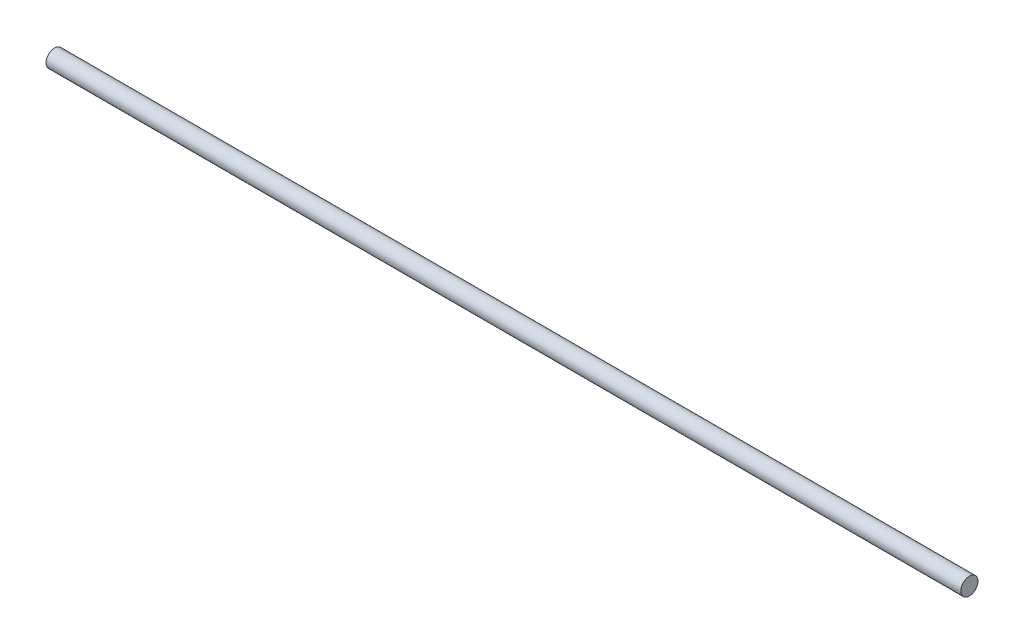
ISO-10303-21;
HEADER;
FILE_DESCRIPTION(('STEP AP214'),'2;1');
FILE_NAME('part.step','',(''),(''),'','','');
FILE_SCHEMA(('AUTOMOTIVE_DESIGN { 1 0 10303 214 1 1 1 1 }'));
ENDSEC;
DATA;
#1=APPLICATION_CONTEXT('core data for automotive mechanical design processes');
#2=APPLICATION_PROTOCOL_DEFINITION('international standard','automotive_design',2000,#1);
#3=PRODUCT_CONTEXT('',#1,'mechanical');
#4=PRODUCT('Part','Part','',(#3));
#5=PRODUCT_RELATED_PRODUCT_CATEGORY('part','',(#4));
#6=PRODUCT_DEFINITION_FORMATION('','',#4);
#7=PRODUCT_DEFINITION_CONTEXT('part definition',#1,'design');
#8=PRODUCT_DEFINITION('design','',#6,#7);
#9=PRODUCT_DEFINITION_SHAPE('','',#8);
#10=(LENGTH_UNIT() NAMED_UNIT(*) SI_UNIT(.MILLI.,.METRE.));
#11=(NAMED_UNIT(*) PLANE_ANGLE_UNIT() SI_UNIT($,.RADIAN.));
#12=(NAMED_UNIT(*) SI_UNIT($,.STERADIAN.) SOLID_ANGLE_UNIT());
#13=UNCERTAINTY_MEASURE_WITH_UNIT(LENGTH_MEASURE(1.E-05),#10,'distance_accuracy_value','');
#14=(GEOMETRIC_REPRESENTATION_CONTEXT(3) GLOBAL_UNCERTAINTY_ASSIGNED_CONTEXT((#13)) GLOBAL_UNIT_ASSIGNED_CONTEXT((#10,
#11,#12)) REPRESENTATION_CONTEXT('',''));
#15=CARTESIAN_POINT('',(0.,0.,0.));
#16=DIRECTION('',(0.,0.,1.));
#17=DIRECTION('',(1.,0.,0.));
#18=AXIS2_PLACEMENT_3D('',#15,#16,#17);
#19=CARTESIAN_POINT('',(425.,0.,0.));
#20=DIRECTION('',(-1.,0.,0.));
#21=DIRECTION('',(0.,0.,1.));
#22=AXIS2_PLACEMENT_3D('',#19,#20,#21);
#23=CYLINDRICAL_SURFACE('',#22,4.);
#24=CARTESIAN_POINT('',(425.,0.,0.));
#25=DIRECTION('',(1.,0.,0.));
#26=DIRECTION('',(0.,0.,-1.));
#27=AXIS2_PLACEMENT_3D('',#24,#25,#26);
#28=CIRCLE('',#27,4.);
#29=CARTESIAN_POINT('',(425.,0.,-4.));
#30=VERTEX_POINT('',#29);
#31=EDGE_CURVE('E10',#30,#30,#28,.T.);
#32=ORIENTED_EDGE('',*,*,#31,.F.);
#33=EDGE_LOOP('',(#32));
#34=FACE_BOUND('',#33,.T.);
#35=CARTESIAN_POINT('',(0.,0.,0.));
#36=DIRECTION('',(1.,0.,0.));
#37=DIRECTION('',(0.,0.,-1.));
#38=AXIS2_PLACEMENT_3D('',#35,#36,#37);
#39=CIRCLE('',#38,4.);
#40=CARTESIAN_POINT('',(0.,0.,-4.));
#41=VERTEX_POINT('',#40);
#42=EDGE_CURVE('E32',#41,#41,#39,.T.);
#43=ORIENTED_EDGE('',*,*,#42,.T.);
#44=EDGE_LOOP('',(#43));
#45=FACE_BOUND('',#44,.T.);
#46=ADVANCED_FACE('F29',(#34,#45),#23,.T.);
#47=CARTESIAN_POINT('',(425.,0.,0.));
#48=DIRECTION('',(1.,0.,0.));
#49=DIRECTION('',(0.,0.,-1.));
#50=AXIS2_PLACEMENT_3D('',#47,#48,#49);
#51=PLANE('',#50);
#52=ORIENTED_EDGE('',*,*,#31,.T.);
#53=EDGE_LOOP('',(#52));
#54=FACE_BOUND('',#53,.T.);
#55=ADVANCED_FACE('F44',(#54),#51,.T.);
#56=CARTESIAN_POINT('',(0.,0.,0.));
#57=DIRECTION('',(1.,0.,0.));
#58=DIRECTION('',(0.,0.,-1.));
#59=AXIS2_PLACEMENT_3D('',#56,#57,#58);
#60=PLANE('',#59);
#61=ORIENTED_EDGE('',*,*,#42,.F.);
#62=EDGE_LOOP('',(#61));
#63=FACE_BOUND('',#62,.T.);
#64=ADVANCED_FACE('F42',(#63),#60,.F.);
#65=CLOSED_SHELL('',(#46,#55,#64));
#66=MANIFOLD_SOLID_BREP('B2',#65);
#67=ADVANCED_BREP_SHAPE_REPRESENTATION('',(#18,#66),#14);
#68=SHAPE_DEFINITION_REPRESENTATION(#9,#67);
ENDSEC;
END-ISO-10303-21;
